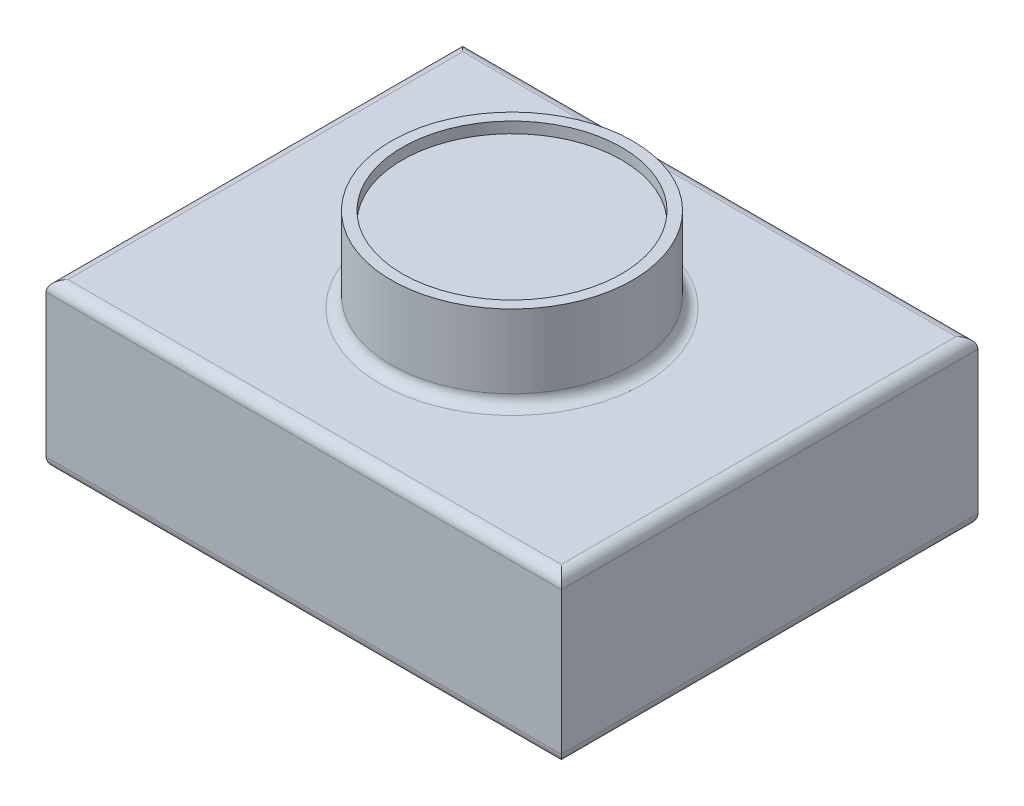
ISO-10303-21;
HEADER;
FILE_DESCRIPTION(('STEP AP214'),'2;1');
FILE_NAME('part.step','',(''),(''),'','','');
FILE_SCHEMA(('AUTOMOTIVE_DESIGN { 1 0 10303 214 1 1 1 1 }'));
ENDSEC;
DATA;
#1=APPLICATION_CONTEXT('core data for automotive mechanical design processes');
#2=APPLICATION_PROTOCOL_DEFINITION('international standard','automotive_design',2000,#1);
#3=PRODUCT_CONTEXT('',#1,'mechanical');
#4=PRODUCT('Part','Part','',(#3));
#5=PRODUCT_RELATED_PRODUCT_CATEGORY('part','',(#4));
#6=PRODUCT_DEFINITION_FORMATION('','',#4);
#7=PRODUCT_DEFINITION_CONTEXT('part definition',#1,'design');
#8=PRODUCT_DEFINITION('design','',#6,#7);
#9=PRODUCT_DEFINITION_SHAPE('','',#8);
#10=(LENGTH_UNIT() NAMED_UNIT(*) SI_UNIT(.MILLI.,.METRE.));
#11=(NAMED_UNIT(*) PLANE_ANGLE_UNIT() SI_UNIT($,.RADIAN.));
#12=(NAMED_UNIT(*) SI_UNIT($,.STERADIAN.) SOLID_ANGLE_UNIT());
#13=UNCERTAINTY_MEASURE_WITH_UNIT(LENGTH_MEASURE(1.E-05),#10,'distance_accuracy_value','');
#14=(GEOMETRIC_REPRESENTATION_CONTEXT(3) GLOBAL_UNCERTAINTY_ASSIGNED_CONTEXT((#13)) GLOBAL_UNIT_ASSIGNED_CONTEXT((#10,
#11,#12)) REPRESENTATION_CONTEXT('',''));
#15=CARTESIAN_POINT('',(0.,0.,0.));
#16=DIRECTION('',(0.,0.,1.));
#17=DIRECTION('',(1.,0.,0.));
#18=AXIS2_PLACEMENT_3D('',#15,#16,#17);
#19=CARTESIAN_POINT('',(0.,5.,0.));
#20=DIRECTION('',(0.,1.,0.));
#21=DIRECTION('',(0.,0.,1.));
#22=AXIS2_PLACEMENT_3D('',#19,#20,#21);
#23=PLANE('',#22);
#24=DIRECTION('',(0.,0.,1.));
#25=VECTOR('',#24,1.);
#26=CARTESIAN_POINT('',(-2.5,5.,10.));
#27=LINE('',#26,#25);
#28=CARTESIAN_POINT('',(-2.5,5.,10.));
#29=VERTEX_POINT('',#28);
#30=CARTESIAN_POINT('',(-2.5,5.,16.));
#31=VERTEX_POINT('',#30);
#32=EDGE_CURVE('E224',#29,#31,#27,.T.);
#33=ORIENTED_EDGE('',*,*,#32,.T.);
#34=DIRECTION('',(-1.,0.,0.));
#35=VECTOR('',#34,1.);
#36=CARTESIAN_POINT('',(-11.5,5.,16.));
#37=LINE('',#36,#35);
#38=CARTESIAN_POINT('',(-11.5,5.,16.));
#39=VERTEX_POINT('',#38);
#40=EDGE_CURVE('E236',#31,#39,#37,.T.);
#41=ORIENTED_EDGE('',*,*,#40,.T.);
#42=DIRECTION('',(0.,0.,-1.));
#43=VECTOR('',#42,1.);
#44=CARTESIAN_POINT('',(-11.5,5.,10.));
#45=LINE('',#44,#43);
#46=CARTESIAN_POINT('',(-11.5,5.,10.));
#47=VERTEX_POINT('',#46);
#48=EDGE_CURVE('E233',#39,#47,#45,.T.);
#49=ORIENTED_EDGE('',*,*,#48,.T.);
#50=DIRECTION('',(1.,0.,0.));
#51=VECTOR('',#50,1.);
#52=CARTESIAN_POINT('',(-11.5,5.,10.));
#53=LINE('',#52,#51);
#54=EDGE_CURVE('E216',#47,#29,#53,.T.);
#55=ORIENTED_EDGE('',*,*,#54,.T.);
#56=EDGE_LOOP('',(#33,#41,#49,#55));
#57=FACE_BOUND('',#56,.T.);
#58=DIRECTION('',(0.,0.,1.));
#59=VECTOR('',#58,1.);
#60=CARTESIAN_POINT('',(-4.,5.,11.));
#61=LINE('',#60,#59);
#62=CARTESIAN_POINT('',(-4.,5.,11.));
#63=VERTEX_POINT('',#62);
#64=CARTESIAN_POINT('',(-4.,5.,15.));
#65=VERTEX_POINT('',#64);
#66=EDGE_CURVE('E184',#63,#65,#61,.T.);
#67=ORIENTED_EDGE('',*,*,#66,.F.);
#68=DIRECTION('',(1.,0.,0.));
#69=VECTOR('',#68,1.);
#70=CARTESIAN_POINT('',(-10.,5.,11.));
#71=LINE('',#70,#69);
#72=CARTESIAN_POINT('',(-10.,5.,11.));
#73=VERTEX_POINT('',#72);
#74=EDGE_CURVE('E181',#73,#63,#71,.T.);
#75=ORIENTED_EDGE('',*,*,#74,.F.);
#76=DIRECTION('',(0.,0.,-1.));
#77=VECTOR('',#76,1.);
#78=CARTESIAN_POINT('',(-10.,5.,11.));
#79=LINE('',#78,#77);
#80=CARTESIAN_POINT('',(-10.,5.,15.));
#81=VERTEX_POINT('',#80);
#82=EDGE_CURVE('E71',#81,#73,#79,.T.);
#83=ORIENTED_EDGE('',*,*,#82,.F.);
#84=DIRECTION('',(-1.,0.,0.));
#85=VECTOR('',#84,1.);
#86=CARTESIAN_POINT('',(-10.,5.,15.));
#87=LINE('',#86,#85);
#88=EDGE_CURVE('E66',#65,#81,#87,.T.);
#89=ORIENTED_EDGE('',*,*,#88,.F.);
#90=EDGE_LOOP('',(#67,#75,#83,#89));
#91=FACE_BOUND('',#90,.T.);
#92=ADVANCED_FACE('F49',(#57,#91),#23,.F.);
#93=CARTESIAN_POINT('',(23.5,15.,19.));
#94=DIRECTION('',(-1.,0.,0.));
#95=DIRECTION('',(0.,0.,1.));
#96=AXIS2_PLACEMENT_3D('',#93,#94,#95);
#97=PLANE('',#96);
#98=DIRECTION('',(0.,-1.,0.));
#99=VECTOR('',#98,1.);
#100=CARTESIAN_POINT('',(23.5,15.,19.));
#101=LINE('',#100,#99);
#102=CARTESIAN_POINT('',(23.5,14.,19.));
#103=VERTEX_POINT('',#102);
#104=CARTESIAN_POINT('',(23.5,1.,19.));
#105=VERTEX_POINT('',#104);
#106=EDGE_CURVE('E250',#103,#105,#101,.T.);
#107=ORIENTED_EDGE('',*,*,#106,.T.);
#108=DIRECTION('',(0.,0.,-1.));
#109=VECTOR('',#108,1.);
#110=CARTESIAN_POINT('',(23.5,1.,-19.));
#111=LINE('',#110,#109);
#112=CARTESIAN_POINT('',(23.5,1.,-19.));
#113=VERTEX_POINT('',#112);
#114=EDGE_CURVE('E288',#105,#113,#111,.T.);
#115=ORIENTED_EDGE('',*,*,#114,.T.);
#116=DIRECTION('',(0.,-1.,0.));
#117=VECTOR('',#116,1.);
#118=CARTESIAN_POINT('',(23.5,15.,-19.));
#119=LINE('',#118,#117);
#120=CARTESIAN_POINT('',(23.5,14.,-19.));
#121=VERTEX_POINT('',#120);
#122=EDGE_CURVE('E260',#121,#113,#119,.T.);
#123=ORIENTED_EDGE('',*,*,#122,.F.);
#124=DIRECTION('',(0.,0.,-1.));
#125=VECTOR('',#124,1.);
#126=CARTESIAN_POINT('',(23.5,14.,19.));
#127=LINE('',#126,#125);
#128=EDGE_CURVE('E286',#121,#103,#127,.F.);
#129=ORIENTED_EDGE('',*,*,#128,.T.);
#130=EDGE_LOOP('',(#107,#115,#123,#129));
#131=FACE_BOUND('',#130,.T.);
#132=ADVANCED_FACE('F335',(#131),#97,.F.);
#133=CARTESIAN_POINT('',(-23.5,15.,-19.));
#134=DIRECTION('',(0.,0.,1.));
#135=DIRECTION('',(1.,0.,0.));
#136=AXIS2_PLACEMENT_3D('',#133,#134,#135);
#137=PLANE('',#136);
#138=ORIENTED_EDGE('',*,*,#122,.T.);
#139=DIRECTION('',(-1.,0.,0.));
#140=VECTOR('',#139,1.);
#141=CARTESIAN_POINT('',(-23.5,1.,-19.));
#142=LINE('',#141,#140);
#143=CARTESIAN_POINT('',(-23.5,1.,-19.));
#144=VERTEX_POINT('',#143);
#145=EDGE_CURVE('E265',#113,#144,#142,.T.);
#146=ORIENTED_EDGE('',*,*,#145,.T.);
#147=DIRECTION('',(0.,-1.,0.));
#148=VECTOR('',#147,1.);
#149=CARTESIAN_POINT('',(-23.5,15.,-19.));
#150=LINE('',#149,#148);
#151=CARTESIAN_POINT('',(-23.5,14.,-19.));
#152=VERTEX_POINT('',#151);
#153=EDGE_CURVE('E257',#152,#144,#150,.T.);
#154=ORIENTED_EDGE('',*,*,#153,.F.);
#155=DIRECTION('',(-1.,0.,0.));
#156=VECTOR('',#155,1.);
#157=CARTESIAN_POINT('',(-23.5,14.,-19.));
#158=LINE('',#157,#156);
#159=EDGE_CURVE('E263',#152,#121,#158,.F.);
#160=ORIENTED_EDGE('',*,*,#159,.T.);
#161=EDGE_LOOP('',(#138,#146,#154,#160));
#162=FACE_BOUND('',#161,.T.);
#163=ADVANCED_FACE('F332',(#162),#137,.F.);
#164=CARTESIAN_POINT('',(-23.5,15.,19.));
#165=DIRECTION('',(1.,0.,0.));
#166=DIRECTION('',(0.,0.,-1.));
#167=AXIS2_PLACEMENT_3D('',#164,#165,#166);
#168=PLANE('',#167);
#169=ORIENTED_EDGE('',*,*,#153,.T.);
#170=DIRECTION('',(0.,0.,1.));
#171=VECTOR('',#170,1.);
#172=CARTESIAN_POINT('',(-23.5,1.,19.));
#173=LINE('',#172,#171);
#174=CARTESIAN_POINT('',(-23.5,1.,19.));
#175=VERTEX_POINT('',#174);
#176=EDGE_CURVE('E279',#144,#175,#173,.T.);
#177=ORIENTED_EDGE('',*,*,#176,.T.);
#178=DIRECTION('',(0.,-1.,0.));
#179=VECTOR('',#178,1.);
#180=CARTESIAN_POINT('',(-23.5,15.,19.));
#181=LINE('',#180,#179);
#182=CARTESIAN_POINT('',(-23.5,14.,19.));
#183=VERTEX_POINT('',#182);
#184=EDGE_CURVE('E254',#183,#175,#181,.T.);
#185=ORIENTED_EDGE('',*,*,#184,.F.);
#186=DIRECTION('',(0.,0.,1.));
#187=VECTOR('',#186,1.);
#188=CARTESIAN_POINT('',(-23.5,14.,19.));
#189=LINE('',#188,#187);
#190=EDGE_CURVE('E277',#183,#152,#189,.F.);
#191=ORIENTED_EDGE('',*,*,#190,.T.);
#192=EDGE_LOOP('',(#169,#177,#185,#191));
#193=FACE_BOUND('',#192,.T.);
#194=ADVANCED_FACE('F349',(#193),#168,.F.);
#195=CARTESIAN_POINT('',(-23.5,15.,19.));
#196=DIRECTION('',(0.,0.,-1.));
#197=DIRECTION('',(-1.,0.,0.));
#198=AXIS2_PLACEMENT_3D('',#195,#196,#197);
#199=PLANE('',#198);
#200=ORIENTED_EDGE('',*,*,#184,.T.);
#201=DIRECTION('',(1.,0.,0.));
#202=VECTOR('',#201,1.);
#203=CARTESIAN_POINT('',(23.5,1.,19.));
#204=LINE('',#203,#202);
#205=EDGE_CURVE('E284',#175,#105,#204,.T.);
#206=ORIENTED_EDGE('',*,*,#205,.T.);
#207=ORIENTED_EDGE('',*,*,#106,.F.);
#208=DIRECTION('',(1.,0.,0.));
#209=VECTOR('',#208,1.);
#210=CARTESIAN_POINT('',(-23.5,14.,19.));
#211=LINE('',#210,#209);
#212=EDGE_CURVE('E281',#103,#183,#211,.F.);
#213=ORIENTED_EDGE('',*,*,#212,.T.);
#214=EDGE_LOOP('',(#200,#206,#207,#213));
#215=FACE_BOUND('',#214,.T.);
#216=ADVANCED_FACE('F353',(#215),#199,.F.);
#217=CARTESIAN_POINT('',(0.,15.,0.));
#218=DIRECTION('',(0.,-1.,0.));
#219=DIRECTION('',(0.,0.,-1.));
#220=AXIS2_PLACEMENT_3D('',#217,#218,#219);
#221=PLANE('',#220);
#222=DIRECTION('',(0.,0.,1.));
#223=VECTOR('',#222,1.);
#224=CARTESIAN_POINT('',(-22.5,15.,0.));
#225=LINE('',#224,#223);
#226=CARTESIAN_POINT('',(-22.5,15.,-18.));
#227=VERTEX_POINT('',#226);
#228=CARTESIAN_POINT('',(-22.5,15.,18.));
#229=VERTEX_POINT('',#228);
#230=EDGE_CURVE('E297',#227,#229,#225,.T.);
#231=ORIENTED_EDGE('',*,*,#230,.T.);
#232=DIRECTION('',(1.,0.,0.));
#233=VECTOR('',#232,1.);
#234=CARTESIAN_POINT('',(0.,15.,18.));
#235=LINE('',#234,#233);
#236=CARTESIAN_POINT('',(22.5,15.,18.));
#237=VERTEX_POINT('',#236);
#238=EDGE_CURVE('E58',#229,#237,#235,.T.);
#239=ORIENTED_EDGE('',*,*,#238,.T.);
#240=DIRECTION('',(0.,0.,-1.));
#241=VECTOR('',#240,1.);
#242=CARTESIAN_POINT('',(22.5,15.,0.));
#243=LINE('',#242,#241);
#244=CARTESIAN_POINT('',(22.5,15.,-18.));
#245=VERTEX_POINT('',#244);
#246=EDGE_CURVE('E293',#237,#245,#243,.T.);
#247=ORIENTED_EDGE('',*,*,#246,.T.);
#248=DIRECTION('',(-1.,0.,0.));
#249=VECTOR('',#248,1.);
#250=CARTESIAN_POINT('',(0.,15.,-18.));
#251=LINE('',#250,#249);
#252=EDGE_CURVE('E295',#245,#227,#251,.T.);
#253=ORIENTED_EDGE('',*,*,#252,.T.);
#254=EDGE_LOOP('',(#231,#239,#247,#253));
#255=FACE_BOUND('',#254,.T.);
#256=CARTESIAN_POINT('',(0.,15.,0.));
#257=DIRECTION('',(0.,-1.,0.));
#258=DIRECTION('',(0.,0.,-1.));
#259=AXIS2_PLACEMENT_3D('',#256,#257,#258);
#260=CIRCLE('',#259,12.);
#261=CARTESIAN_POINT('',(0.,15.,-12.));
#262=VERTEX_POINT('',#261);
#263=EDGE_CURVE('E290',#262,#262,#260,.T.);
#264=ORIENTED_EDGE('',*,*,#263,.T.);
#265=EDGE_LOOP('',(#264));
#266=FACE_BOUND('',#265,.T.);
#267=ADVANCED_FACE('F366',(#255,#266),#221,.F.);
#268=CARTESIAN_POINT('',(0.,0.,0.));
#269=DIRECTION('',(0.,-1.,0.));
#270=DIRECTION('',(0.,0.,-1.));
#271=AXIS2_PLACEMENT_3D('',#268,#269,#270);
#272=PLANE('',#271);
#273=DIRECTION('',(0.,0.,1.));
#274=VECTOR('',#273,1.);
#275=CARTESIAN_POINT('',(-2.5,0.,10.));
#276=LINE('',#275,#274);
#277=CARTESIAN_POINT('',(-2.5,0.,10.));
#278=VERTEX_POINT('',#277);
#279=CARTESIAN_POINT('',(-2.5,0.,16.));
#280=VERTEX_POINT('',#279);
#281=EDGE_CURVE('E212',#278,#280,#276,.T.);
#282=ORIENTED_EDGE('',*,*,#281,.F.);
#283=DIRECTION('',(1.,0.,0.));
#284=VECTOR('',#283,1.);
#285=CARTESIAN_POINT('',(-11.5,0.,10.));
#286=LINE('',#285,#284);
#287=CARTESIAN_POINT('',(-11.5,0.,10.));
#288=VERTEX_POINT('',#287);
#289=EDGE_CURVE('E220',#288,#278,#286,.T.);
#290=ORIENTED_EDGE('',*,*,#289,.F.);
#291=DIRECTION('',(0.,0.,-1.));
#292=VECTOR('',#291,1.);
#293=CARTESIAN_POINT('',(-11.5,0.,10.));
#294=LINE('',#293,#292);
#295=CARTESIAN_POINT('',(-11.5,0.,16.));
#296=VERTEX_POINT('',#295);
#297=EDGE_CURVE('E223',#296,#288,#294,.T.);
#298=ORIENTED_EDGE('',*,*,#297,.F.);
#299=DIRECTION('',(-1.,0.,0.));
#300=VECTOR('',#299,1.);
#301=CARTESIAN_POINT('',(-11.5,0.,16.));
#302=LINE('',#301,#300);
#303=EDGE_CURVE('E227',#280,#296,#302,.T.);
#304=ORIENTED_EDGE('',*,*,#303,.F.);
#305=EDGE_LOOP('',(#282,#290,#298,#304));
#306=FACE_BOUND('',#305,.T.);
#307=CARTESIAN_POINT('',(19.5,0.,-14.));
#308=DIRECTION('',(0.,-1.,0.));
#309=DIRECTION('',(0.,0.,-1.));
#310=AXIS2_PLACEMENT_3D('',#307,#308,#309);
#311=CIRCLE('',#310,1.5);
#312=CARTESIAN_POINT('',(19.5,0.,-15.5));
#313=VERTEX_POINT('',#312);
#314=EDGE_CURVE('E206',#313,#313,#311,.T.);
#315=ORIENTED_EDGE('',*,*,#314,.F.);
#316=EDGE_LOOP('',(#315));
#317=FACE_BOUND('',#316,.T.);
#318=CARTESIAN_POINT('',(-19.5,0.,-14.));
#319=DIRECTION('',(0.,-1.,0.));
#320=DIRECTION('',(0.,0.,-1.));
#321=AXIS2_PLACEMENT_3D('',#318,#319,#320);
#322=CIRCLE('',#321,1.5);
#323=CARTESIAN_POINT('',(-19.5,0.,-15.5));
#324=VERTEX_POINT('',#323);
#325=EDGE_CURVE('E200',#324,#324,#322,.T.);
#326=ORIENTED_EDGE('',*,*,#325,.F.);
#327=EDGE_LOOP('',(#326));
#328=FACE_BOUND('',#327,.T.);
#329=CARTESIAN_POINT('',(-19.5,0.,14.));
#330=DIRECTION('',(0.,-1.,0.));
#331=DIRECTION('',(0.,0.,-1.));
#332=AXIS2_PLACEMENT_3D('',#329,#330,#331);
#333=CIRCLE('',#332,1.5);
#334=CARTESIAN_POINT('',(-19.5,0.,12.5));
#335=VERTEX_POINT('',#334);
#336=EDGE_CURVE('E193',#335,#335,#333,.T.);
#337=ORIENTED_EDGE('',*,*,#336,.F.);
#338=EDGE_LOOP('',(#337));
#339=FACE_BOUND('',#338,.T.);
#340=CARTESIAN_POINT('',(19.5,0.,14.));
#341=DIRECTION('',(0.,-1.,0.));
#342=DIRECTION('',(0.,0.,-1.));
#343=AXIS2_PLACEMENT_3D('',#340,#341,#342);
#344=CIRCLE('',#343,1.5);
#345=CARTESIAN_POINT('',(19.5,0.,12.5));
#346=VERTEX_POINT('',#345);
#347=EDGE_CURVE('E196',#346,#346,#344,.T.);
#348=ORIENTED_EDGE('',*,*,#347,.F.);
#349=EDGE_LOOP('',(#348));
#350=FACE_BOUND('',#349,.T.);
#351=DIRECTION('',(0.,0.,1.));
#352=VECTOR('',#351,1.);
#353=CARTESIAN_POINT('',(-22.5,0.,-19.));
#354=LINE('',#353,#352);
#355=CARTESIAN_POINT('',(-22.5,0.,18.));
#356=VERTEX_POINT('',#355);
#357=CARTESIAN_POINT('',(-22.5,0.,-18.));
#358=VERTEX_POINT('',#357);
#359=EDGE_CURVE('E272',#356,#358,#354,.F.);
#360=ORIENTED_EDGE('',*,*,#359,.T.);
#361=DIRECTION('',(-1.,0.,0.));
#362=VECTOR('',#361,1.);
#363=CARTESIAN_POINT('',(23.5,0.,-18.));
#364=LINE('',#363,#362);
#365=CARTESIAN_POINT('',(22.5,0.,-18.));
#366=VERTEX_POINT('',#365);
#367=EDGE_CURVE('E274',#358,#366,#364,.F.);
#368=ORIENTED_EDGE('',*,*,#367,.T.);
#369=DIRECTION('',(0.,0.,-1.));
#370=VECTOR('',#369,1.);
#371=CARTESIAN_POINT('',(22.5,0.,19.));
#372=LINE('',#371,#370);
#373=CARTESIAN_POINT('',(22.5,0.,18.));
#374=VERTEX_POINT('',#373);
#375=EDGE_CURVE('E268',#366,#374,#372,.F.);
#376=ORIENTED_EDGE('',*,*,#375,.T.);
#377=DIRECTION('',(1.,0.,0.));
#378=VECTOR('',#377,1.);
#379=CARTESIAN_POINT('',(-23.5,0.,18.));
#380=LINE('',#379,#378);
#381=EDGE_CURVE('E270',#374,#356,#380,.F.);
#382=ORIENTED_EDGE('',*,*,#381,.T.);
#383=EDGE_LOOP('',(#360,#368,#376,#382));
#384=FACE_BOUND('',#383,.T.);
#385=ADVANCED_FACE('F363',(#306,#317,#328,#339,#350,#384),#272,.T.);
#386=CARTESIAN_POINT('',(0.,22.7,0.));
#387=DIRECTION('',(0.,-1.,0.));
#388=DIRECTION('',(0.,0.,-1.));
#389=AXIS2_PLACEMENT_3D('',#386,#387,#388);
#390=CYLINDRICAL_SURFACE('',#389,11.);
#391=CARTESIAN_POINT('',(0.,16.,0.));
#392=DIRECTION('',(0.,-1.,0.));
#393=DIRECTION('',(0.,0.,-1.));
#394=AXIS2_PLACEMENT_3D('',#391,#392,#393);
#395=CIRCLE('',#394,11.);
#396=CARTESIAN_POINT('',(0.,16.,-11.));
#397=VERTEX_POINT('',#396);
#398=EDGE_CURVE('E11',#397,#397,#395,.F.);
#399=CARTESIAN_POINT('',(0.,22.7,0.));
#400=DIRECTION('',(0.,1.,0.));
#401=DIRECTION('',(0.,0.,1.));
#402=AXIS2_PLACEMENT_3D('',#399,#400,#401);
#403=CIRCLE('',#402,11.);
#404=CARTESIAN_POINT('',(0.,22.7,-11.));
#405=VERTEX_POINT('',#404);
#406=EDGE_CURVE('E247',#405,#405,#403,.T.);
#407=CARTESIAN_POINT('',(0.,16.,-11.));
#408=CARTESIAN_POINT('',(0.,16.0697916666667,-11.));
#409=CARTESIAN_POINT('',(0.,16.1395833333333,-11.));
#410=CARTESIAN_POINT('',(0.,16.2791666666667,-11.));
#411=CARTESIAN_POINT('',(0.,16.3489583333333,-11.));
#412=CARTESIAN_POINT('',(0.,16.4885416666667,-11.));
#413=CARTESIAN_POINT('',(0.,16.5583333333333,-11.));
#414=CARTESIAN_POINT('',(0.,16.6979166666667,-11.));
#415=CARTESIAN_POINT('',(0.,16.7677083333333,-11.));
#416=CARTESIAN_POINT('',(0.,16.9072916666667,-11.));
#417=CARTESIAN_POINT('',(0.,16.9770833333333,-11.));
#418=CARTESIAN_POINT('',(0.,17.1166666666667,-11.));
#419=CARTESIAN_POINT('',(0.,17.1864583333333,-11.));
#420=CARTESIAN_POINT('',(0.,17.3260416666667,-11.));
#421=CARTESIAN_POINT('',(0.,17.3958333333333,-11.));
#422=CARTESIAN_POINT('',(0.,17.5354166666667,-11.));
#423=CARTESIAN_POINT('',(0.,17.6052083333333,-11.));
#424=CARTESIAN_POINT('',(0.,17.7447916666667,-11.));
#425=CARTESIAN_POINT('',(0.,17.8145833333333,-11.));
#426=CARTESIAN_POINT('',(0.,17.9541666666667,-11.));
#427=CARTESIAN_POINT('',(0.,18.0239583333333,-11.));
#428=CARTESIAN_POINT('',(0.,18.1635416666667,-11.));
#429=CARTESIAN_POINT('',(0.,18.2333333333333,-11.));
#430=CARTESIAN_POINT('',(0.,18.3729166666667,-11.));
#431=CARTESIAN_POINT('',(0.,18.4427083333333,-11.));
#432=CARTESIAN_POINT('',(0.,18.5822916666667,-11.));
#433=CARTESIAN_POINT('',(0.,18.6520833333333,-11.));
#434=CARTESIAN_POINT('',(0.,18.7916666666667,-11.));
#435=CARTESIAN_POINT('',(0.,18.8614583333333,-11.));
#436=CARTESIAN_POINT('',(0.,19.0010416666667,-11.));
#437=CARTESIAN_POINT('',(0.,19.0708333333333,-11.));
#438=CARTESIAN_POINT('',(0.,19.2104166666667,-11.));
#439=CARTESIAN_POINT('',(0.,19.2802083333333,-11.));
#440=CARTESIAN_POINT('',(0.,19.4197916666667,-11.));
#441=CARTESIAN_POINT('',(0.,19.4895833333333,-11.));
#442=CARTESIAN_POINT('',(0.,19.6291666666667,-11.));
#443=CARTESIAN_POINT('',(0.,19.6989583333333,-11.));
#444=CARTESIAN_POINT('',(0.,19.8385416666667,-11.));
#445=CARTESIAN_POINT('',(0.,19.9083333333333,-11.));
#446=CARTESIAN_POINT('',(0.,20.0479166666667,-11.));
#447=CARTESIAN_POINT('',(0.,20.1177083333333,-11.));
#448=CARTESIAN_POINT('',(0.,20.2572916666667,-11.));
#449=CARTESIAN_POINT('',(0.,20.3270833333333,-11.));
#450=CARTESIAN_POINT('',(0.,20.4666666666667,-11.));
#451=CARTESIAN_POINT('',(0.,20.5364583333333,-11.));
#452=CARTESIAN_POINT('',(0.,20.6760416666667,-11.));
#453=CARTESIAN_POINT('',(0.,20.7458333333333,-11.));
#454=CARTESIAN_POINT('',(0.,20.8854166666667,-11.));
#455=CARTESIAN_POINT('',(0.,20.9552083333333,-11.));
#456=CARTESIAN_POINT('',(0.,21.0947916666667,-11.));
#457=CARTESIAN_POINT('',(0.,21.1645833333333,-11.));
#458=CARTESIAN_POINT('',(0.,21.3041666666667,-11.));
#459=CARTESIAN_POINT('',(0.,21.3739583333333,-11.));
#460=CARTESIAN_POINT('',(0.,21.5135416666667,-11.));
#461=CARTESIAN_POINT('',(0.,21.5833333333333,-11.));
#462=CARTESIAN_POINT('',(0.,21.7229166666667,-11.));
#463=CARTESIAN_POINT('',(0.,21.7927083333333,-11.));
#464=CARTESIAN_POINT('',(0.,21.9322916666667,-11.));
#465=CARTESIAN_POINT('',(0.,22.0020833333333,-11.));
#466=CARTESIAN_POINT('',(0.,22.1416666666667,-11.));
#467=CARTESIAN_POINT('',(0.,22.2114583333333,-11.));
#468=CARTESIAN_POINT('',(0.,22.3510416666667,-11.));
#469=CARTESIAN_POINT('',(0.,22.4208333333333,-11.));
#470=CARTESIAN_POINT('',(0.,22.5604166666667,-11.));
#471=CARTESIAN_POINT('',(0.,22.6302083333333,-11.));
#472=CARTESIAN_POINT('',(0.,22.7,-11.));
#473=B_SPLINE_CURVE_WITH_KNOTS('',3,(#407,#408,#409,#410,#411,#412,#413,#414,#415,#416,#417,
#418,#419,#420,#421,#422,#423,#424,#425,#426,#427,#428,#429,#430,#431,#432,#433,#434,#435,#436,
#437,#438,#439,#440,#441,#442,#443,#444,#445,#446,#447,#448,#449,#450,#451,#452,#453,#454,#455,
#456,#457,#458,#459,#460,#461,#462,#463,#464,#465,#466,#467,#468,#469,#470,#471,#472),
.UNSPECIFIED.,.F.,.F.,(4,2,2,2,2,2,2,2,2,2,2,2,2,2,2,2,2,2,2,2,2,2,2,2,2,2,2,2,2,2,2,2,4),(0.,
0.209374999999998,0.418749999999999,0.628124999999997,0.837499999999998,1.046875,1.25625,
1.465625,1.675,1.884375,2.09375,2.303125,2.5125,2.72187499999999,2.93125,3.140625,3.35,3.559375,
3.76874999999999,3.978125,4.1875,4.39687499999999,4.60625,4.81562499999999,5.025,
5.23437499999999,5.44374999999999,5.65312499999999,5.86249999999999,6.07187499999999,
6.28124999999999,6.49062499999999,6.69999999999999),.UNSPECIFIED.);
#474=EDGE_CURVE('BSEAM365',#397,#405,#473,.T.);
#475=ORIENTED_EDGE('',*,*,#398,.T.);
#476=ORIENTED_EDGE('',*,*,#406,.F.);
#477=ORIENTED_EDGE('',*,*,#474,.T.);
#478=ORIENTED_EDGE('',*,*,#474,.F.);
#479=EDGE_LOOP('',(#475,#477,#476,#478));
#480=FACE_BOUND('',#479,.T.);
#481=ADVANCED_FACE('F365',(#480),#390,.T.);
#482=CARTESIAN_POINT('',(0.,22.7,0.));
#483=DIRECTION('',(0.,1.,0.));
#484=DIRECTION('',(0.,0.,1.));
#485=AXIS2_PLACEMENT_3D('',#482,#483,#484);
#486=PLANE('',#485);
#487=CARTESIAN_POINT('',(0.,22.7,0.));
#488=DIRECTION('',(0.,1.,0.));
#489=DIRECTION('',(0.,0.,1.));
#490=AXIS2_PLACEMENT_3D('',#487,#488,#489);
#491=CIRCLE('',#490,10.);
#492=CARTESIAN_POINT('',(0.,22.7,10.));
#493=VERTEX_POINT('',#492);
#494=EDGE_CURVE('E415',#493,#493,#491,.T.);
#495=ORIENTED_EDGE('',*,*,#494,.F.);
#496=EDGE_LOOP('',(#495));
#497=FACE_BOUND('',#496,.T.);
#498=ORIENTED_EDGE('',*,*,#406,.T.);
#499=EDGE_LOOP('',(#498));
#500=FACE_BOUND('',#499,.T.);
#501=ADVANCED_FACE('F374',(#497,#500),#486,.T.);
#502=CARTESIAN_POINT('',(-23.5,1.,18.));
#503=DIRECTION('',(-1.,0.,0.));
#504=DIRECTION('',(0.,0.,1.));
#505=AXIS2_PLACEMENT_3D('',#502,#503,#504);
#506=CYLINDRICAL_SURFACE('',#505,1.);
#507=CARTESIAN_POINT('',(-22.5,1.,18.));
#508=DIRECTION('',(-0.707106781186547,0.,-0.707106781186547));
#509=DIRECTION('',(-0.707106781186547,0.,0.707106781186547));
#510=AXIS2_PLACEMENT_3D('',#507,#508,#509);
#511=ELLIPSE('',#510,1.41421356237309,1.);
#512=EDGE_CURVE('E305',#356,#175,#511,.T.);
#513=ORIENTED_EDGE('',*,*,#512,.F.);
#514=ORIENTED_EDGE('',*,*,#381,.F.);
#515=CARTESIAN_POINT('',(22.5,1.,18.));
#516=DIRECTION('',(-0.707106781186547,0.,0.707106781186547));
#517=DIRECTION('',(0.707106781186547,0.,0.707106781186547));
#518=AXIS2_PLACEMENT_3D('',#515,#516,#517);
#519=ELLIPSE('',#518,1.41421356237309,1.);
#520=EDGE_CURVE('E251',#105,#374,#519,.F.);
#521=ORIENTED_EDGE('',*,*,#520,.F.);
#522=ORIENTED_EDGE('',*,*,#205,.F.);
#523=EDGE_LOOP('',(#513,#514,#521,#522));
#524=FACE_BOUND('',#523,.T.);
#525=ADVANCED_FACE('F357',(#524),#506,.T.);
#526=CARTESIAN_POINT('',(22.5,1.,19.));
#527=DIRECTION('',(0.,0.,1.));
#528=DIRECTION('',(1.,0.,0.));
#529=AXIS2_PLACEMENT_3D('',#526,#527,#528);
#530=CYLINDRICAL_SURFACE('',#529,1.);
#531=ORIENTED_EDGE('',*,*,#520,.T.);
#532=ORIENTED_EDGE('',*,*,#375,.F.);
#533=CARTESIAN_POINT('',(22.5,1.,-18.));
#534=DIRECTION('',(0.707106781186547,0.,0.707106781186547));
#535=DIRECTION('',(-0.707106781186547,0.,0.707106781186547));
#536=AXIS2_PLACEMENT_3D('',#533,#534,#535);
#537=ELLIPSE('',#536,1.41421356237309,1.);
#538=EDGE_CURVE('E303',#113,#366,#537,.F.);
#539=ORIENTED_EDGE('',*,*,#538,.F.);
#540=ORIENTED_EDGE('',*,*,#114,.F.);
#541=EDGE_LOOP('',(#531,#532,#539,#540));
#542=FACE_BOUND('',#541,.T.);
#543=ADVANCED_FACE('F340',(#542),#530,.T.);
#544=CARTESIAN_POINT('',(-22.5,1.,19.));
#545=DIRECTION('',(0.,0.,-1.));
#546=DIRECTION('',(-1.,0.,0.));
#547=AXIS2_PLACEMENT_3D('',#544,#545,#546);
#548=CYLINDRICAL_SURFACE('',#547,1.);
#549=ORIENTED_EDGE('',*,*,#512,.T.);
#550=ORIENTED_EDGE('',*,*,#176,.F.);
#551=CARTESIAN_POINT('',(-22.5,1.,-18.));
#552=DIRECTION('',(0.707106781186547,0.,-0.707106781186547));
#553=DIRECTION('',(-0.707106781186547,0.,-0.707106781186547));
#554=AXIS2_PLACEMENT_3D('',#551,#552,#553);
#555=ELLIPSE('',#554,1.41421356237309,1.);
#556=EDGE_CURVE('E301',#358,#144,#555,.T.);
#557=ORIENTED_EDGE('',*,*,#556,.F.);
#558=ORIENTED_EDGE('',*,*,#359,.F.);
#559=EDGE_LOOP('',(#549,#550,#557,#558));
#560=FACE_BOUND('',#559,.T.);
#561=ADVANCED_FACE('F361',(#560),#548,.T.);
#562=CARTESIAN_POINT('',(-23.5,1.,-18.));
#563=DIRECTION('',(1.,0.,0.));
#564=DIRECTION('',(0.,0.,-1.));
#565=AXIS2_PLACEMENT_3D('',#562,#563,#564);
#566=CYLINDRICAL_SURFACE('',#565,1.);
#567=ORIENTED_EDGE('',*,*,#538,.T.);
#568=ORIENTED_EDGE('',*,*,#367,.F.);
#569=ORIENTED_EDGE('',*,*,#556,.T.);
#570=ORIENTED_EDGE('',*,*,#145,.F.);
#571=EDGE_LOOP('',(#567,#568,#569,#570));
#572=FACE_BOUND('',#571,.T.);
#573=ADVANCED_FACE('F345',(#572),#566,.T.);
#574=CARTESIAN_POINT('',(0.,14.,-18.));
#575=DIRECTION('',(-1.,0.,0.));
#576=DIRECTION('',(0.,0.,1.));
#577=AXIS2_PLACEMENT_3D('',#574,#575,#576);
#578=CYLINDRICAL_SURFACE('',#577,1.);
#579=CARTESIAN_POINT('',(22.5,14.,-18.));
#580=DIRECTION('',(-0.707106781186547,0.,-0.707106781186547));
#581=DIRECTION('',(0.707106781186547,0.,-0.707106781186547));
#582=AXIS2_PLACEMENT_3D('',#579,#580,#581);
#583=ELLIPSE('',#582,1.41421356237309,1.);
#584=EDGE_CURVE('E312',#121,#245,#583,.F.);
#585=ORIENTED_EDGE('',*,*,#584,.F.);
#586=ORIENTED_EDGE('',*,*,#159,.F.);
#587=CARTESIAN_POINT('',(-22.5,14.,-18.));
#588=DIRECTION('',(-0.707106781186547,0.,0.707106781186547));
#589=DIRECTION('',(-0.707106781186547,0.,-0.707106781186547));
#590=AXIS2_PLACEMENT_3D('',#587,#588,#589);
#591=ELLIPSE('',#590,1.41421356237309,1.);
#592=EDGE_CURVE('E53',#227,#152,#591,.T.);
#593=ORIENTED_EDGE('',*,*,#592,.F.);
#594=ORIENTED_EDGE('',*,*,#252,.F.);
#595=EDGE_LOOP('',(#585,#586,#593,#594));
#596=FACE_BOUND('',#595,.T.);
#597=ADVANCED_FACE('F328',(#596),#578,.T.);
#598=CARTESIAN_POINT('',(-22.5,14.,0.));
#599=DIRECTION('',(0.,0.,1.));
#600=DIRECTION('',(1.,0.,0.));
#601=AXIS2_PLACEMENT_3D('',#598,#599,#600);
#602=CYLINDRICAL_SURFACE('',#601,1.);
#603=ORIENTED_EDGE('',*,*,#592,.T.);
#604=ORIENTED_EDGE('',*,*,#190,.F.);
#605=CARTESIAN_POINT('',(-22.5,14.,18.));
#606=DIRECTION('',(0.707106781186547,0.,0.707106781186547));
#607=DIRECTION('',(-0.707106781186547,0.,0.707106781186547));
#608=AXIS2_PLACEMENT_3D('',#605,#606,#607);
#609=ELLIPSE('',#608,1.41421356237309,1.);
#610=EDGE_CURVE('E311',#229,#183,#609,.T.);
#611=ORIENTED_EDGE('',*,*,#610,.F.);
#612=ORIENTED_EDGE('',*,*,#230,.F.);
#613=EDGE_LOOP('',(#603,#604,#611,#612));
#614=FACE_BOUND('',#613,.T.);
#615=ADVANCED_FACE('F323',(#614),#602,.T.);
#616=CARTESIAN_POINT('',(22.5,14.,0.));
#617=DIRECTION('',(0.,0.,-1.));
#618=DIRECTION('',(-1.,0.,0.));
#619=AXIS2_PLACEMENT_3D('',#616,#617,#618);
#620=CYLINDRICAL_SURFACE('',#619,1.);
#621=ORIENTED_EDGE('',*,*,#584,.T.);
#622=ORIENTED_EDGE('',*,*,#246,.F.);
#623=CARTESIAN_POINT('',(22.5,14.,18.));
#624=DIRECTION('',(0.707106781186547,0.,-0.707106781186547));
#625=DIRECTION('',(-0.707106781186547,0.,-0.707106781186547));
#626=AXIS2_PLACEMENT_3D('',#623,#624,#625);
#627=ELLIPSE('',#626,1.41421356237309,1.);
#628=EDGE_CURVE('E244',#103,#237,#627,.F.);
#629=ORIENTED_EDGE('',*,*,#628,.F.);
#630=ORIENTED_EDGE('',*,*,#128,.F.);
#631=EDGE_LOOP('',(#621,#622,#629,#630));
#632=FACE_BOUND('',#631,.T.);
#633=ADVANCED_FACE('F558',(#632),#620,.T.);
#634=CARTESIAN_POINT('',(0.,14.,18.));
#635=DIRECTION('',(1.,0.,0.));
#636=DIRECTION('',(0.,0.,-1.));
#637=AXIS2_PLACEMENT_3D('',#634,#635,#636);
#638=CYLINDRICAL_SURFACE('',#637,1.);
#639=ORIENTED_EDGE('',*,*,#610,.T.);
#640=ORIENTED_EDGE('',*,*,#212,.F.);
#641=ORIENTED_EDGE('',*,*,#628,.T.);
#642=ORIENTED_EDGE('',*,*,#238,.F.);
#643=EDGE_LOOP('',(#639,#640,#641,#642));
#644=FACE_BOUND('',#643,.T.);
#645=ADVANCED_FACE('F549',(#644),#638,.T.);
#646=CARTESIAN_POINT('',(0.,16.,0.));
#647=DIRECTION('',(0.,-1.,0.));
#648=DIRECTION('',(0.,0.,-1.));
#649=AXIS2_PLACEMENT_3D('',#646,#647,#648);
#650=TOROIDAL_SURFACE('',#649,12.,1.);
#651=ORIENTED_EDGE('',*,*,#263,.F.);
#652=EDGE_LOOP('',(#651));
#653=FACE_BOUND('',#652,.T.);
#654=ORIENTED_EDGE('',*,*,#398,.F.);
#655=EDGE_LOOP('',(#654));
#656=FACE_BOUND('',#655,.T.);
#657=ADVANCED_FACE('F51',(#653,#656),#650,.F.);
#658=CARTESIAN_POINT('',(19.5,5.,14.));
#659=DIRECTION('',(0.,-1.,0.));
#660=DIRECTION('',(0.,0.,-1.));
#661=AXIS2_PLACEMENT_3D('',#658,#659,#660);
#662=CYLINDRICAL_SURFACE('',#661,1.5);
#663=CARTESIAN_POINT('',(19.5,5.,14.));
#664=DIRECTION('',(0.,-1.,0.));
#665=DIRECTION('',(0.,0.,-1.));
#666=AXIS2_PLACEMENT_3D('',#663,#664,#665);
#667=CIRCLE('',#666,1.5);
#668=CARTESIAN_POINT('',(19.5,5.,12.5));
#669=VERTEX_POINT('',#668);
#670=EDGE_CURVE('E241',#669,#669,#667,.T.);
#671=ORIENTED_EDGE('',*,*,#670,.F.);
#672=EDGE_LOOP('',(#671));
#673=FACE_BOUND('',#672,.T.);
#674=ORIENTED_EDGE('',*,*,#347,.T.);
#675=EDGE_LOOP('',(#674));
#676=FACE_BOUND('',#675,.T.);
#677=ADVANCED_FACE('F400',(#673,#676),#662,.F.);
#678=CARTESIAN_POINT('',(19.5,5.,14.));
#679=DIRECTION('',(0.,-1.,0.));
#680=DIRECTION('',(0.,0.,-1.));
#681=AXIS2_PLACEMENT_3D('',#678,#679,#680);
#682=PLANE('',#681);
#683=ORIENTED_EDGE('',*,*,#670,.T.);
#684=EDGE_LOOP('',(#683));
#685=FACE_BOUND('',#684,.T.);
#686=ADVANCED_FACE('F396',(#685),#682,.T.);
#687=CARTESIAN_POINT('',(-19.5,5.,14.));
#688=DIRECTION('',(0.,-1.,0.));
#689=DIRECTION('',(0.,0.,-1.));
#690=AXIS2_PLACEMENT_3D('',#687,#688,#689);
#691=CYLINDRICAL_SURFACE('',#690,1.5);
#692=CARTESIAN_POINT('',(-19.5,5.,14.));
#693=DIRECTION('',(0.,-1.,0.));
#694=DIRECTION('',(0.,0.,-1.));
#695=AXIS2_PLACEMENT_3D('',#692,#693,#694);
#696=CIRCLE('',#695,1.5);
#697=CARTESIAN_POINT('',(-19.5,5.,12.5));
#698=VERTEX_POINT('',#697);
#699=EDGE_CURVE('E197',#698,#698,#696,.T.);
#700=ORIENTED_EDGE('',*,*,#699,.F.);
#701=EDGE_LOOP('',(#700));
#702=FACE_BOUND('',#701,.T.);
#703=ORIENTED_EDGE('',*,*,#336,.T.);
#704=EDGE_LOOP('',(#703));
#705=FACE_BOUND('',#704,.T.);
#706=ADVANCED_FACE('F399',(#702,#705),#691,.F.);
#707=CARTESIAN_POINT('',(-19.5,5.,14.));
#708=DIRECTION('',(0.,-1.,0.));
#709=DIRECTION('',(0.,0.,-1.));
#710=AXIS2_PLACEMENT_3D('',#707,#708,#709);
#711=PLANE('',#710);
#712=ORIENTED_EDGE('',*,*,#699,.T.);
#713=EDGE_LOOP('',(#712));
#714=FACE_BOUND('',#713,.T.);
#715=ADVANCED_FACE('F453',(#714),#711,.T.);
#716=CARTESIAN_POINT('',(-19.5,5.,-14.));
#717=DIRECTION('',(0.,-1.,0.));
#718=DIRECTION('',(0.,0.,-1.));
#719=AXIS2_PLACEMENT_3D('',#716,#717,#718);
#720=CYLINDRICAL_SURFACE('',#719,1.5);
#721=CARTESIAN_POINT('',(-19.5,5.,-14.));
#722=DIRECTION('',(0.,-1.,0.));
#723=DIRECTION('',(0.,0.,-1.));
#724=AXIS2_PLACEMENT_3D('',#721,#722,#723);
#725=CIRCLE('',#724,1.5);
#726=CARTESIAN_POINT('',(-19.5,5.,-15.5));
#727=VERTEX_POINT('',#726);
#728=EDGE_CURVE('E203',#727,#727,#725,.T.);
#729=ORIENTED_EDGE('',*,*,#728,.F.);
#730=EDGE_LOOP('',(#729));
#731=FACE_BOUND('',#730,.T.);
#732=ORIENTED_EDGE('',*,*,#325,.T.);
#733=EDGE_LOOP('',(#732));
#734=FACE_BOUND('',#733,.T.);
#735=ADVANCED_FACE('F457',(#731,#734),#720,.F.);
#736=CARTESIAN_POINT('',(-19.5,5.,-14.));
#737=DIRECTION('',(0.,-1.,0.));
#738=DIRECTION('',(0.,0.,-1.));
#739=AXIS2_PLACEMENT_3D('',#736,#737,#738);
#740=PLANE('',#739);
#741=ORIENTED_EDGE('',*,*,#728,.T.);
#742=EDGE_LOOP('',(#741));
#743=FACE_BOUND('',#742,.T.);
#744=ADVANCED_FACE('F461',(#743),#740,.T.);
#745=CARTESIAN_POINT('',(19.5,5.,-14.));
#746=DIRECTION('',(0.,-1.,0.));
#747=DIRECTION('',(0.,0.,-1.));
#748=AXIS2_PLACEMENT_3D('',#745,#746,#747);
#749=CYLINDRICAL_SURFACE('',#748,1.5);
#750=CARTESIAN_POINT('',(19.5,5.,-14.));
#751=DIRECTION('',(0.,-1.,0.));
#752=DIRECTION('',(0.,0.,-1.));
#753=AXIS2_PLACEMENT_3D('',#750,#751,#752);
#754=CIRCLE('',#753,1.5);
#755=CARTESIAN_POINT('',(19.5,5.,-15.5));
#756=VERTEX_POINT('',#755);
#757=EDGE_CURVE('E209',#756,#756,#754,.T.);
#758=ORIENTED_EDGE('',*,*,#757,.F.);
#759=EDGE_LOOP('',(#758));
#760=FACE_BOUND('',#759,.T.);
#761=ORIENTED_EDGE('',*,*,#314,.T.);
#762=EDGE_LOOP('',(#761));
#763=FACE_BOUND('',#762,.T.);
#764=ADVANCED_FACE('F465',(#760,#763),#749,.F.);
#765=CARTESIAN_POINT('',(19.5,5.,-14.));
#766=DIRECTION('',(0.,-1.,0.));
#767=DIRECTION('',(0.,0.,-1.));
#768=AXIS2_PLACEMENT_3D('',#765,#766,#767);
#769=PLANE('',#768);
#770=ORIENTED_EDGE('',*,*,#757,.T.);
#771=EDGE_LOOP('',(#770));
#772=FACE_BOUND('',#771,.T.);
#773=ADVANCED_FACE('F469',(#772),#769,.T.);
#774=CARTESIAN_POINT('',(-2.5,5.,10.));
#775=DIRECTION('',(1.,0.,0.));
#776=DIRECTION('',(0.,0.,-1.));
#777=AXIS2_PLACEMENT_3D('',#774,#775,#776);
#778=PLANE('',#777);
#779=ORIENTED_EDGE('',*,*,#281,.T.);
#780=DIRECTION('',(0.,-1.,0.));
#781=VECTOR('',#780,1.);
#782=CARTESIAN_POINT('',(-2.5,5.,16.));
#783=LINE('',#782,#781);
#784=EDGE_CURVE('E213',#31,#280,#783,.T.);
#785=ORIENTED_EDGE('',*,*,#784,.F.);
#786=ORIENTED_EDGE('',*,*,#32,.F.);
#787=DIRECTION('',(0.,-1.,0.));
#788=VECTOR('',#787,1.);
#789=CARTESIAN_POINT('',(-2.5,5.,10.));
#790=LINE('',#789,#788);
#791=EDGE_CURVE('E185',#29,#278,#790,.T.);
#792=ORIENTED_EDGE('',*,*,#791,.T.);
#793=EDGE_LOOP('',(#779,#785,#786,#792));
#794=FACE_BOUND('',#793,.T.);
#795=ADVANCED_FACE('F473',(#794),#778,.F.);
#796=CARTESIAN_POINT('',(-11.5,5.,10.));
#797=DIRECTION('',(0.,0.,-1.));
#798=DIRECTION('',(-1.,0.,0.));
#799=AXIS2_PLACEMENT_3D('',#796,#797,#798);
#800=PLANE('',#799);
#801=ORIENTED_EDGE('',*,*,#289,.T.);
#802=ORIENTED_EDGE('',*,*,#791,.F.);
#803=ORIENTED_EDGE('',*,*,#54,.F.);
#804=DIRECTION('',(0.,-1.,0.));
#805=VECTOR('',#804,1.);
#806=CARTESIAN_POINT('',(-11.5,5.,10.));
#807=LINE('',#806,#805);
#808=EDGE_CURVE('E187',#47,#288,#807,.T.);
#809=ORIENTED_EDGE('',*,*,#808,.T.);
#810=EDGE_LOOP('',(#801,#802,#803,#809));
#811=FACE_BOUND('',#810,.T.);
#812=ADVANCED_FACE('F394',(#811),#800,.F.);
#813=CARTESIAN_POINT('',(-11.5,5.,10.));
#814=DIRECTION('',(-1.,0.,0.));
#815=DIRECTION('',(0.,0.,1.));
#816=AXIS2_PLACEMENT_3D('',#813,#814,#815);
#817=PLANE('',#816);
#818=ORIENTED_EDGE('',*,*,#297,.T.);
#819=ORIENTED_EDGE('',*,*,#808,.F.);
#820=ORIENTED_EDGE('',*,*,#48,.F.);
#821=DIRECTION('',(0.,-1.,0.));
#822=VECTOR('',#821,1.);
#823=CARTESIAN_POINT('',(-11.5,5.,16.));
#824=LINE('',#823,#822);
#825=EDGE_CURVE('E217',#39,#296,#824,.T.);
#826=ORIENTED_EDGE('',*,*,#825,.T.);
#827=EDGE_LOOP('',(#818,#819,#820,#826));
#828=FACE_BOUND('',#827,.T.);
#829=ADVANCED_FACE('F478',(#828),#817,.F.);
#830=CARTESIAN_POINT('',(-11.5,5.,16.));
#831=DIRECTION('',(0.,0.,1.));
#832=DIRECTION('',(1.,0.,0.));
#833=AXIS2_PLACEMENT_3D('',#830,#831,#832);
#834=PLANE('',#833);
#835=ORIENTED_EDGE('',*,*,#303,.T.);
#836=ORIENTED_EDGE('',*,*,#825,.F.);
#837=ORIENTED_EDGE('',*,*,#40,.F.);
#838=ORIENTED_EDGE('',*,*,#784,.T.);
#839=EDGE_LOOP('',(#835,#836,#837,#838));
#840=FACE_BOUND('',#839,.T.);
#841=ADVANCED_FACE('F450',(#840),#834,.F.);
#842=CARTESIAN_POINT('',(-4.,0.,11.));
#843=DIRECTION('',(-1.,0.,0.));
#844=DIRECTION('',(0.,0.,1.));
#845=AXIS2_PLACEMENT_3D('',#842,#843,#844);
#846=PLANE('',#845);
#847=ORIENTED_EDGE('',*,*,#66,.T.);
#848=DIRECTION('',(0.,1.,0.));
#849=VECTOR('',#848,1.);
#850=CARTESIAN_POINT('',(-4.,0.,15.));
#851=LINE('',#850,#849);
#852=CARTESIAN_POINT('',(-4.,0.,15.));
#853=VERTEX_POINT('',#852);
#854=EDGE_CURVE('E165',#853,#65,#851,.T.);
#855=ORIENTED_EDGE('',*,*,#854,.F.);
#856=DIRECTION('',(0.,0.,1.));
#857=VECTOR('',#856,1.);
#858=CARTESIAN_POINT('',(-4.,0.,11.));
#859=LINE('',#858,#857);
#860=CARTESIAN_POINT('',(-4.,0.,11.));
#861=VERTEX_POINT('',#860);
#862=EDGE_CURVE('E172',#861,#853,#859,.T.);
#863=ORIENTED_EDGE('',*,*,#862,.F.);
#864=DIRECTION('',(0.,1.,0.));
#865=VECTOR('',#864,1.);
#866=CARTESIAN_POINT('',(-4.,0.,11.));
#867=LINE('',#866,#865);
#868=EDGE_CURVE('E426',#861,#63,#867,.T.);
#869=ORIENTED_EDGE('',*,*,#868,.T.);
#870=EDGE_LOOP('',(#847,#855,#863,#869));
#871=FACE_BOUND('',#870,.T.);
#872=ADVANCED_FACE('F183',(#871),#846,.F.);
#873=CARTESIAN_POINT('',(-10.,0.,15.));
#874=DIRECTION('',(0.,0.,-1.));
#875=DIRECTION('',(-1.,0.,0.));
#876=AXIS2_PLACEMENT_3D('',#873,#874,#875);
#877=PLANE('',#876);
#878=ORIENTED_EDGE('',*,*,#88,.T.);
#879=DIRECTION('',(0.,1.,0.));
#880=VECTOR('',#879,1.);
#881=CARTESIAN_POINT('',(-10.,0.,15.));
#882=LINE('',#881,#880);
#883=CARTESIAN_POINT('',(-10.,0.,15.));
#884=VERTEX_POINT('',#883);
#885=EDGE_CURVE('E168',#884,#81,#882,.T.);
#886=ORIENTED_EDGE('',*,*,#885,.F.);
#887=DIRECTION('',(-1.,0.,0.));
#888=VECTOR('',#887,1.);
#889=CARTESIAN_POINT('',(-10.,0.,15.));
#890=LINE('',#889,#888);
#891=EDGE_CURVE('E161',#853,#884,#890,.T.);
#892=ORIENTED_EDGE('',*,*,#891,.F.);
#893=ORIENTED_EDGE('',*,*,#854,.T.);
#894=EDGE_LOOP('',(#878,#886,#892,#893));
#895=FACE_BOUND('',#894,.T.);
#896=ADVANCED_FACE('F163',(#895),#877,.F.);
#897=CARTESIAN_POINT('',(-10.,0.,11.));
#898=DIRECTION('',(1.,0.,0.));
#899=DIRECTION('',(0.,0.,-1.));
#900=AXIS2_PLACEMENT_3D('',#897,#898,#899);
#901=PLANE('',#900);
#902=ORIENTED_EDGE('',*,*,#82,.T.);
#903=DIRECTION('',(0.,1.,0.));
#904=VECTOR('',#903,1.);
#905=CARTESIAN_POINT('',(-10.,0.,11.));
#906=LINE('',#905,#904);
#907=CARTESIAN_POINT('',(-10.,0.,11.));
#908=VERTEX_POINT('',#907);
#909=EDGE_CURVE('E189',#908,#73,#906,.T.);
#910=ORIENTED_EDGE('',*,*,#909,.F.);
#911=DIRECTION('',(0.,0.,-1.));
#912=VECTOR('',#911,1.);
#913=CARTESIAN_POINT('',(-10.,0.,11.));
#914=LINE('',#913,#912);
#915=EDGE_CURVE('E171',#884,#908,#914,.T.);
#916=ORIENTED_EDGE('',*,*,#915,.F.);
#917=ORIENTED_EDGE('',*,*,#885,.T.);
#918=EDGE_LOOP('',(#902,#910,#916,#917));
#919=FACE_BOUND('',#918,.T.);
#920=ADVANCED_FACE('F437',(#919),#901,.F.);
#921=CARTESIAN_POINT('',(-10.,0.,11.));
#922=DIRECTION('',(0.,0.,1.));
#923=DIRECTION('',(1.,0.,0.));
#924=AXIS2_PLACEMENT_3D('',#921,#922,#923);
#925=PLANE('',#924);
#926=ORIENTED_EDGE('',*,*,#74,.T.);
#927=ORIENTED_EDGE('',*,*,#868,.F.);
#928=DIRECTION('',(1.,0.,0.));
#929=VECTOR('',#928,1.);
#930=CARTESIAN_POINT('',(-10.,0.,11.));
#931=LINE('',#930,#929);
#932=EDGE_CURVE('E177',#908,#861,#931,.T.);
#933=ORIENTED_EDGE('',*,*,#932,.F.);
#934=ORIENTED_EDGE('',*,*,#909,.T.);
#935=EDGE_LOOP('',(#926,#927,#933,#934));
#936=FACE_BOUND('',#935,.T.);
#937=ADVANCED_FACE('F435',(#936),#925,.F.);
#938=CARTESIAN_POINT('',(0.,0.,0.));
#939=DIRECTION('',(0.,1.,0.));
#940=DIRECTION('',(0.,0.,1.));
#941=AXIS2_PLACEMENT_3D('',#938,#939,#940);
#942=PLANE('',#941);
#943=ORIENTED_EDGE('',*,*,#862,.T.);
#944=ORIENTED_EDGE('',*,*,#891,.T.);
#945=ORIENTED_EDGE('',*,*,#915,.T.);
#946=ORIENTED_EDGE('',*,*,#932,.T.);
#947=EDGE_LOOP('',(#943,#944,#945,#946));
#948=FACE_BOUND('',#947,.T.);
#949=ADVANCED_FACE('F175',(#948),#942,.F.);
#950=CARTESIAN_POINT('',(0.,21.7,0.));
#951=DIRECTION('',(0.,1.,0.));
#952=DIRECTION('',(0.,0.,1.));
#953=AXIS2_PLACEMENT_3D('',#950,#951,#952);
#954=CYLINDRICAL_SURFACE('',#953,10.);
#955=CARTESIAN_POINT('',(0.,21.7,0.));
#956=DIRECTION('',(0.,1.,0.));
#957=DIRECTION('',(0.,0.,1.));
#958=AXIS2_PLACEMENT_3D('',#955,#956,#957);
#959=CIRCLE('',#958,10.);
#960=CARTESIAN_POINT('',(0.,21.7,10.));
#961=VERTEX_POINT('',#960);
#962=EDGE_CURVE('E419',#961,#961,#959,.T.);
#963=ORIENTED_EDGE('',*,*,#962,.F.);
#964=EDGE_LOOP('',(#963));
#965=FACE_BOUND('',#964,.T.);
#966=ORIENTED_EDGE('',*,*,#494,.T.);
#967=EDGE_LOOP('',(#966));
#968=FACE_BOUND('',#967,.T.);
#969=ADVANCED_FACE('F720',(#965,#968),#954,.F.);
#970=CARTESIAN_POINT('',(0.,21.7,0.));
#971=DIRECTION('',(0.,1.,0.));
#972=DIRECTION('',(0.,0.,1.));
#973=AXIS2_PLACEMENT_3D('',#970,#971,#972);
#974=PLANE('',#973);
#975=ORIENTED_EDGE('',*,*,#962,.T.);
#976=EDGE_LOOP('',(#975));
#977=FACE_BOUND('',#976,.T.);
#978=ADVANCED_FACE('F726',(#977),#974,.T.);
#979=CLOSED_SHELL('',(#92,#132,#163,#194,#216,#267,#385,#481,#501,#525,#543,#561,#573,#597,#615,
#633,#645,#657,#677,#686,#706,#715,#735,#744,#764,#773,#795,#812,#829,#841,#872,#896,#920,#937,
#949,#969,#978));
#980=MANIFOLD_SOLID_BREP('B2',#979);
#981=ADVANCED_BREP_SHAPE_REPRESENTATION('',(#18,#980),#14);
#982=SHAPE_DEFINITION_REPRESENTATION(#9,#981);
ENDSEC;
END-ISO-10303-21;
